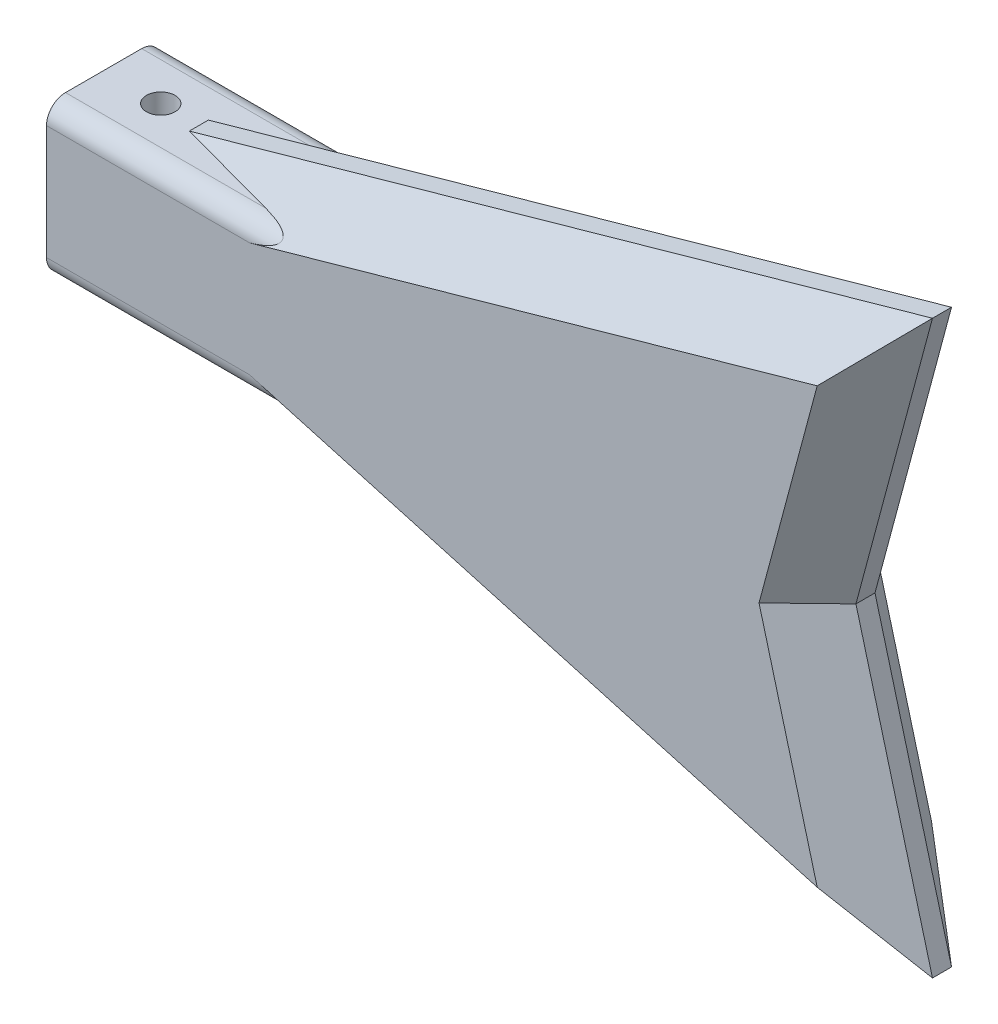
ISO-10303-21;
HEADER;
FILE_DESCRIPTION(('STEP AP214'),'2;1');
FILE_NAME('part.step','',(''),(''),'','','');
FILE_SCHEMA(('AUTOMOTIVE_DESIGN { 1 0 10303 214 1 1 1 1 }'));
ENDSEC;
DATA;
#1=APPLICATION_CONTEXT('core data for automotive mechanical design processes');
#2=APPLICATION_PROTOCOL_DEFINITION('international standard','automotive_design',2000,#1);
#3=PRODUCT_CONTEXT('',#1,'mechanical');
#4=PRODUCT('Part','Part','',(#3));
#5=PRODUCT_RELATED_PRODUCT_CATEGORY('part','',(#4));
#6=PRODUCT_DEFINITION_FORMATION('','',#4);
#7=PRODUCT_DEFINITION_CONTEXT('part definition',#1,'design');
#8=PRODUCT_DEFINITION('design','',#6,#7);
#9=PRODUCT_DEFINITION_SHAPE('','',#8);
#10=(LENGTH_UNIT() NAMED_UNIT(*) SI_UNIT(.MILLI.,.METRE.));
#11=(NAMED_UNIT(*) PLANE_ANGLE_UNIT() SI_UNIT($,.RADIAN.));
#12=(NAMED_UNIT(*) SI_UNIT($,.STERADIAN.) SOLID_ANGLE_UNIT());
#13=UNCERTAINTY_MEASURE_WITH_UNIT(LENGTH_MEASURE(1.E-05),#10,'distance_accuracy_value','');
#14=(GEOMETRIC_REPRESENTATION_CONTEXT(3) GLOBAL_UNCERTAINTY_ASSIGNED_CONTEXT((#13)) GLOBAL_UNIT_ASSIGNED_CONTEXT((#10,
#11,#12)) REPRESENTATION_CONTEXT('',''));
#15=CARTESIAN_POINT('',(0.,0.,0.));
#16=DIRECTION('',(0.,0.,1.));
#17=DIRECTION('',(1.,0.,0.));
#18=AXIS2_PLACEMENT_3D('',#15,#16,#17);
#19=CARTESIAN_POINT('',(10.,8.,6.));
#20=DIRECTION('',(0.,-1.,0.));
#21=DIRECTION('',(1.,0.,0.));
#22=AXIS2_PLACEMENT_3D('',#19,#20,#21);
#23=PLANE('',#22);
#24=CARTESIAN_POINT('',(6.,8.,0.));
#25=DIRECTION('',(0.,1.,0.));
#26=DIRECTION('',(-1.,0.,0.));
#27=AXIS2_PLACEMENT_3D('',#24,#25,#26);
#28=CIRCLE('',#27,1.5);
#29=CARTESIAN_POINT('',(4.5,8.,0.));
#30=VERTEX_POINT('',#29);
#31=EDGE_CURVE('E182',#30,#30,#28,.T.);
#32=ORIENTED_EDGE('',*,*,#31,.F.);
#33=EDGE_LOOP('',(#32));
#34=FACE_BOUND('',#33,.T.);
#35=DIRECTION('',(0.965103812505989,0.,-0.261867583114835));
#36=VECTOR('',#35,1.);
#37=CARTESIAN_POINT('',(8.23089418014901,8.,-0.519977582395162));
#38=LINE('',#37,#36);
#39=CARTESIAN_POINT('',(10.,8.,-0.999999999999996));
#40=VERTEX_POINT('',#39);
#41=CARTESIAN_POINT('',(21.0563950034561,8.,-4.));
#42=VERTEX_POINT('',#41);
#43=EDGE_CURVE('E209',#40,#42,#38,.T.);
#44=ORIENTED_EDGE('',*,*,#43,.T.);
#45=DIRECTION('',(-1.,0.,0.));
#46=VECTOR('',#45,1.);
#47=CARTESIAN_POINT('',(0.,8.,-4.));
#48=LINE('',#47,#46);
#49=CARTESIAN_POINT('',(0.,8.,-4.));
#50=VERTEX_POINT('',#49);
#51=EDGE_CURVE('E241',#42,#50,#48,.T.);
#52=ORIENTED_EDGE('',*,*,#51,.T.);
#53=DIRECTION('',(0.,0.,-1.));
#54=VECTOR('',#53,1.);
#55=CARTESIAN_POINT('',(0.,8.,6.));
#56=LINE('',#55,#54);
#57=CARTESIAN_POINT('',(0.,8.,4.));
#58=VERTEX_POINT('',#57);
#59=EDGE_CURVE('E177',#58,#50,#56,.T.);
#60=ORIENTED_EDGE('',*,*,#59,.F.);
#61=DIRECTION('',(-1.,0.,0.));
#62=VECTOR('',#61,1.);
#63=CARTESIAN_POINT('',(10.,8.,4.));
#64=LINE('',#63,#62);
#65=CARTESIAN_POINT('',(21.056395003456,8.,4.));
#66=VERTEX_POINT('',#65);
#67=EDGE_CURVE('E62',#58,#66,#64,.F.);
#68=ORIENTED_EDGE('',*,*,#67,.T.);
#69=DIRECTION('',(0.965103812505989,0.,0.261867583114835));
#70=VECTOR('',#69,1.);
#71=CARTESIAN_POINT('',(11.2636470141793,8.,1.34287315543202));
#72=LINE('',#71,#70);
#73=CARTESIAN_POINT('',(10.,8.,0.999999999999995));
#74=VERTEX_POINT('',#73);
#75=EDGE_CURVE('E257',#66,#74,#72,.F.);
#76=ORIENTED_EDGE('',*,*,#75,.T.);
#77=DIRECTION('',(0.,0.,-1.));
#78=VECTOR('',#77,1.);
#79=CARTESIAN_POINT('',(10.,8.,6.));
#80=LINE('',#79,#78);
#81=EDGE_CURVE('E328',#74,#40,#80,.T.);
#82=ORIENTED_EDGE('',*,*,#81,.T.);
#83=EDGE_LOOP('',(#44,#52,#60,#68,#76,#82));
#84=FACE_BOUND('',#83,.T.);
#85=ADVANCED_FACE('F39',(#34,#84),#23,.F.);
#86=CARTESIAN_POINT('',(0.,-8.,6.));
#87=DIRECTION('',(1.,0.,0.));
#88=DIRECTION('',(0.,0.,-1.));
#89=AXIS2_PLACEMENT_3D('',#86,#87,#88);
#90=PLANE('',#89);
#91=CARTESIAN_POINT('',(0.,0.,0.));
#92=DIRECTION('',(-1.,0.,0.));
#93=DIRECTION('',(0.,0.,1.));
#94=AXIS2_PLACEMENT_3D('',#91,#92,#93);
#95=CIRCLE('',#94,5.);
#96=CARTESIAN_POINT('',(0.,0.,5.));
#97=VERTEX_POINT('',#96);
#98=EDGE_CURVE('E343',#97,#97,#95,.T.);
#99=ORIENTED_EDGE('',*,*,#98,.F.);
#100=EDGE_LOOP('',(#99));
#101=FACE_BOUND('',#100,.T.);
#102=DIRECTION('',(0.,0.,-1.));
#103=VECTOR('',#102,1.);
#104=CARTESIAN_POINT('',(0.,-8.,6.));
#105=LINE('',#104,#103);
#106=CARTESIAN_POINT('',(0.,-8.,4.));
#107=VERTEX_POINT('',#106);
#108=CARTESIAN_POINT('',(0.,-8.,-4.));
#109=VERTEX_POINT('',#108);
#110=EDGE_CURVE('E308',#107,#109,#105,.T.);
#111=ORIENTED_EDGE('',*,*,#110,.F.);
#112=CARTESIAN_POINT('',(0.,-6.,4.));
#113=DIRECTION('',(1.,0.,0.));
#114=DIRECTION('',(0.,0.,-1.));
#115=AXIS2_PLACEMENT_3D('',#112,#113,#114);
#116=CIRCLE('',#115,2.);
#117=CARTESIAN_POINT('',(0.,-6.,6.));
#118=VERTEX_POINT('',#117);
#119=EDGE_CURVE('E229',#107,#118,#116,.F.);
#120=ORIENTED_EDGE('',*,*,#119,.T.);
#121=DIRECTION('',(0.,-1.,0.));
#122=VECTOR('',#121,1.);
#123=CARTESIAN_POINT('',(0.,-8.,6.));
#124=LINE('',#123,#122);
#125=CARTESIAN_POINT('',(0.,6.,6.));
#126=VERTEX_POINT('',#125);
#127=EDGE_CURVE('E332',#126,#118,#124,.T.);
#128=ORIENTED_EDGE('',*,*,#127,.F.);
#129=CARTESIAN_POINT('',(0.,6.,4.));
#130=DIRECTION('',(1.,0.,0.));
#131=DIRECTION('',(0.,0.,-1.));
#132=AXIS2_PLACEMENT_3D('',#129,#130,#131);
#133=CIRCLE('',#132,2.);
#134=EDGE_CURVE('E220',#126,#58,#133,.F.);
#135=ORIENTED_EDGE('',*,*,#134,.T.);
#136=ORIENTED_EDGE('',*,*,#59,.T.);
#137=CARTESIAN_POINT('',(0.,6.,-4.));
#138=DIRECTION('',(1.,0.,0.));
#139=DIRECTION('',(0.,0.,-1.));
#140=AXIS2_PLACEMENT_3D('',#137,#138,#139);
#141=CIRCLE('',#140,2.);
#142=CARTESIAN_POINT('',(0.,6.,-6.));
#143=VERTEX_POINT('',#142);
#144=EDGE_CURVE('E223',#50,#143,#141,.F.);
#145=ORIENTED_EDGE('',*,*,#144,.T.);
#146=DIRECTION('',(0.,-1.,0.));
#147=VECTOR('',#146,1.);
#148=CARTESIAN_POINT('',(0.,-8.,-6.));
#149=LINE('',#148,#147);
#150=CARTESIAN_POINT('',(0.,-6.,-6.));
#151=VERTEX_POINT('',#150);
#152=EDGE_CURVE('E335',#143,#151,#149,.T.);
#153=ORIENTED_EDGE('',*,*,#152,.T.);
#154=CARTESIAN_POINT('',(0.,-6.,-4.));
#155=DIRECTION('',(1.,0.,0.));
#156=DIRECTION('',(0.,0.,-1.));
#157=AXIS2_PLACEMENT_3D('',#154,#155,#156);
#158=CIRCLE('',#157,2.);
#159=EDGE_CURVE('E226',#151,#109,#158,.F.);
#160=ORIENTED_EDGE('',*,*,#159,.T.);
#161=EDGE_LOOP('',(#111,#120,#128,#135,#136,#145,#153,#160));
#162=FACE_BOUND('',#161,.T.);
#163=ADVANCED_FACE('F389',(#101,#162),#90,.F.);
#164=CARTESIAN_POINT('',(10.,-8.,6.));
#165=DIRECTION('',(0.,1.,0.));
#166=DIRECTION('',(-1.,0.,0.));
#167=AXIS2_PLACEMENT_3D('',#164,#165,#166);
#168=PLANE('',#167);
#169=CARTESIAN_POINT('',(6.,-8.,0.));
#170=DIRECTION('',(0.,1.,0.));
#171=DIRECTION('',(-1.,0.,0.));
#172=AXIS2_PLACEMENT_3D('',#169,#170,#171);
#173=CIRCLE('',#172,1.5);
#174=CARTESIAN_POINT('',(4.5,-8.,0.));
#175=VERTEX_POINT('',#174);
#176=EDGE_CURVE('E347',#175,#175,#173,.T.);
#177=ORIENTED_EDGE('',*,*,#176,.T.);
#178=EDGE_LOOP('',(#177));
#179=FACE_BOUND('',#178,.T.);
#180=DIRECTION('',(-0.965103812505989,0.,-0.261867583114835));
#181=VECTOR('',#180,1.);
#182=CARTESIAN_POINT('',(11.2636470141793,-8.,1.34287315543202));
#183=LINE('',#182,#181);
#184=CARTESIAN_POINT('',(10.,-8.,0.999999999999996));
#185=VERTEX_POINT('',#184);
#186=CARTESIAN_POINT('',(21.056395003456,-8.,4.));
#187=VERTEX_POINT('',#186);
#188=EDGE_CURVE('E260',#185,#187,#183,.F.);
#189=ORIENTED_EDGE('',*,*,#188,.T.);
#190=DIRECTION('',(1.,0.,0.));
#191=VECTOR('',#190,1.);
#192=CARTESIAN_POINT('',(10.,-8.,4.));
#193=LINE('',#192,#191);
#194=EDGE_CURVE('E217',#187,#107,#193,.F.);
#195=ORIENTED_EDGE('',*,*,#194,.T.);
#196=ORIENTED_EDGE('',*,*,#110,.T.);
#197=DIRECTION('',(1.,0.,0.));
#198=VECTOR('',#197,1.);
#199=CARTESIAN_POINT('',(28.4273250057601,-7.99999999999999,-4.));
#200=LINE('',#199,#198);
#201=CARTESIAN_POINT('',(21.0563950034561,-8.,-4.));
#202=VERTEX_POINT('',#201);
#203=EDGE_CURVE('E213',#109,#202,#200,.T.);
#204=ORIENTED_EDGE('',*,*,#203,.T.);
#205=DIRECTION('',(-0.965103812505989,0.,0.261867583114834));
#206=VECTOR('',#205,1.);
#207=CARTESIAN_POINT('',(8.23089418014901,-8.,-0.519977582395164));
#208=LINE('',#207,#206);
#209=CARTESIAN_POINT('',(10.,-8.,-0.999999999999995));
#210=VERTEX_POINT('',#209);
#211=EDGE_CURVE('E254',#202,#210,#208,.T.);
#212=ORIENTED_EDGE('',*,*,#211,.T.);
#213=DIRECTION('',(0.,0.,-1.));
#214=VECTOR('',#213,1.);
#215=CARTESIAN_POINT('',(10.,-8.,6.));
#216=LINE('',#215,#214);
#217=EDGE_CURVE('E312',#185,#210,#216,.T.);
#218=ORIENTED_EDGE('',*,*,#217,.F.);
#219=EDGE_LOOP('',(#189,#195,#196,#204,#212,#218));
#220=FACE_BOUND('',#219,.T.);
#221=ADVANCED_FACE('F395',(#179,#220),#168,.F.);
#222=CARTESIAN_POINT('',(10.,-8.,6.));
#223=DIRECTION('',(0.27133618137397,0.962484637112402,0.));
#224=DIRECTION('',(-0.962484637112402,0.27133618137397,0.));
#225=AXIS2_PLACEMENT_3D('',#222,#223,#224);
#226=PLANE('',#225);
#227=DIRECTION('',(0.,0.,-1.));
#228=VECTOR('',#227,1.);
#229=CARTESIAN_POINT('',(88.0384757729336,-30.,6.));
#230=LINE('',#229,#228);
#231=CARTESIAN_POINT('',(88.0384757729336,-30.,0.999999999999997));
#232=VERTEX_POINT('',#231);
#233=CARTESIAN_POINT('',(88.0384757729336,-30.,-0.999999999999996));
#234=VERTEX_POINT('',#233);
#235=EDGE_CURVE('E316',#232,#234,#230,.T.);
#236=ORIENTED_EDGE('',*,*,#235,.F.);
#237=DIRECTION('',(-0.962484637112402,0.27133618137397,0.));
#238=VECTOR('',#237,1.);
#239=CARTESIAN_POINT('',(10.,-8.,0.999999999999996));
#240=LINE('',#239,#238);
#241=EDGE_CURVE('E293',#232,#185,#240,.T.);
#242=ORIENTED_EDGE('',*,*,#241,.T.);
#243=ORIENTED_EDGE('',*,*,#217,.T.);
#244=DIRECTION('',(0.962484637112402,-0.27133618137397,0.));
#245=VECTOR('',#244,1.);
#246=CARTESIAN_POINT('',(88.0384757729336,-30.,-0.999999999999995));
#247=LINE('',#246,#245);
#248=EDGE_CURVE('E296',#210,#234,#247,.T.);
#249=ORIENTED_EDGE('',*,*,#248,.T.);
#250=EDGE_LOOP('',(#236,#242,#243,#249));
#251=FACE_BOUND('',#250,.T.);
#252=ADVANCED_FACE('F460',(#251),#226,.F.);
#253=CARTESIAN_POINT('',(88.0384757729336,-30.,6.));
#254=DIRECTION('',(-0.965925826289069,-0.258819045102518,0.));
#255=DIRECTION('',(0.258819045102518,-0.965925826289069,0.));
#256=AXIS2_PLACEMENT_3D('',#253,#254,#255);
#257=PLANE('',#256);
#258=DIRECTION('',(0.,0.,-1.));
#259=VECTOR('',#258,1.);
#260=CARTESIAN_POINT('',(80.,0.,6.));
#261=LINE('',#260,#259);
#262=CARTESIAN_POINT('',(80.,0.,0.999999999999996));
#263=VERTEX_POINT('',#262);
#264=CARTESIAN_POINT('',(80.,0.,-0.999999999999996));
#265=VERTEX_POINT('',#264);
#266=EDGE_CURVE('E320',#263,#265,#261,.T.);
#267=ORIENTED_EDGE('',*,*,#266,.F.);
#268=DIRECTION('',(0.258819045102518,-0.965925826289069,0.));
#269=VECTOR('',#268,1.);
#270=CARTESIAN_POINT('',(88.0384757729336,-30.,0.999999999999997));
#271=LINE('',#270,#269);
#272=EDGE_CURVE('E287',#263,#232,#271,.T.);
#273=ORIENTED_EDGE('',*,*,#272,.T.);
#274=ORIENTED_EDGE('',*,*,#235,.T.);
#275=DIRECTION('',(-0.258819045102518,0.965925826289069,0.));
#276=VECTOR('',#275,1.);
#277=CARTESIAN_POINT('',(80.,0.,-0.999999999999996));
#278=LINE('',#277,#276);
#279=EDGE_CURVE('E290',#234,#265,#278,.T.);
#280=ORIENTED_EDGE('',*,*,#279,.T.);
#281=EDGE_LOOP('',(#267,#273,#274,#280));
#282=FACE_BOUND('',#281,.T.);
#283=ADVANCED_FACE('F468',(#282),#257,.F.);
#284=CARTESIAN_POINT('',(88.0384757729336,30.,6.));
#285=DIRECTION('',(-0.965925826289069,0.258819045102518,0.));
#286=DIRECTION('',(-0.258819045102518,-0.965925826289069,0.));
#287=AXIS2_PLACEMENT_3D('',#284,#285,#286);
#288=PLANE('',#287);
#289=DIRECTION('',(0.,0.,-1.));
#290=VECTOR('',#289,1.);
#291=CARTESIAN_POINT('',(88.0384757729336,30.,6.));
#292=LINE('',#291,#290);
#293=CARTESIAN_POINT('',(88.0384757729336,30.,0.999999999999996));
#294=VERTEX_POINT('',#293);
#295=CARTESIAN_POINT('',(88.0384757729336,30.,-0.999999999999996));
#296=VERTEX_POINT('',#295);
#297=EDGE_CURVE('E324',#294,#296,#292,.T.);
#298=ORIENTED_EDGE('',*,*,#297,.F.);
#299=DIRECTION('',(-0.258819045102518,-0.965925826289069,0.));
#300=VECTOR('',#299,1.);
#301=CARTESIAN_POINT('',(88.0384757729336,30.,0.999999999999996));
#302=LINE('',#301,#300);
#303=EDGE_CURVE('E180',#294,#263,#302,.T.);
#304=ORIENTED_EDGE('',*,*,#303,.T.);
#305=ORIENTED_EDGE('',*,*,#266,.T.);
#306=DIRECTION('',(0.258819045102518,0.965925826289069,0.));
#307=VECTOR('',#306,1.);
#308=CARTESIAN_POINT('',(88.0384757729336,30.,-0.999999999999996));
#309=LINE('',#308,#307);
#310=EDGE_CURVE('E284',#265,#296,#309,.T.);
#311=ORIENTED_EDGE('',*,*,#310,.T.);
#312=EDGE_LOOP('',(#298,#304,#305,#311));
#313=FACE_BOUND('',#312,.T.);
#314=ADVANCED_FACE('F472',(#313),#288,.F.);
#315=CARTESIAN_POINT('',(10.,8.,6.));
#316=DIRECTION('',(0.27133618137397,-0.962484637112402,0.));
#317=DIRECTION('',(0.962484637112402,0.27133618137397,0.));
#318=AXIS2_PLACEMENT_3D('',#315,#316,#317);
#319=PLANE('',#318);
#320=ORIENTED_EDGE('',*,*,#81,.F.);
#321=DIRECTION('',(0.962484637112402,0.27133618137397,0.));
#322=VECTOR('',#321,1.);
#323=CARTESIAN_POINT('',(10.,8.,0.999999999999995));
#324=LINE('',#323,#322);
#325=EDGE_CURVE('E276',#74,#294,#324,.T.);
#326=ORIENTED_EDGE('',*,*,#325,.T.);
#327=ORIENTED_EDGE('',*,*,#297,.T.);
#328=DIRECTION('',(-0.962484637112402,-0.27133618137397,0.));
#329=VECTOR('',#328,1.);
#330=CARTESIAN_POINT('',(10.,8.,-0.999999999999996));
#331=LINE('',#330,#329);
#332=EDGE_CURVE('E279',#296,#40,#331,.T.);
#333=ORIENTED_EDGE('',*,*,#332,.T.);
#334=EDGE_LOOP('',(#320,#326,#327,#333));
#335=FACE_BOUND('',#334,.T.);
#336=ADVANCED_FACE('F478',(#335),#319,.F.);
#337=CARTESIAN_POINT('',(0.,0.,6.));
#338=DIRECTION('',(0.,0.,-1.));
#339=DIRECTION('',(-1.,0.,0.));
#340=AXIS2_PLACEMENT_3D('',#337,#338,#339);
#341=PLANE('',#340);
#342=ORIENTED_EDGE('',*,*,#127,.T.);
#343=DIRECTION('',(1.,0.,0.));
#344=VECTOR('',#343,1.);
#345=CARTESIAN_POINT('',(0.,-6.,6.));
#346=LINE('',#345,#344);
#347=CARTESIAN_POINT('',(21.3329181173116,-6.,6.));
#348=VERTEX_POINT('',#347);
#349=EDGE_CURVE('E208',#118,#348,#346,.T.);
#350=ORIENTED_EDGE('',*,*,#349,.T.);
#351=DIRECTION('',(0.962484637112402,-0.27133618137397,0.));
#352=VECTOR('',#351,1.);
#353=CARTESIAN_POINT('',(0.00365889157440522,0.0129788327947733,6.));
#354=LINE('',#353,#352);
#355=CARTESIAN_POINT('',(80.9334265058361,-22.8021116706935,6.));
#356=VERTEX_POINT('',#355);
#357=EDGE_CURVE('E300',#348,#356,#354,.T.);
#358=ORIENTED_EDGE('',*,*,#357,.T.);
#359=DIRECTION('',(-0.258819045102518,0.965925826289069,0.));
#360=VECTOR('',#359,1.);
#361=CARTESIAN_POINT('',(69.8113870199323,18.7059047744872,6.));
#362=LINE('',#361,#360);
#363=CARTESIAN_POINT('',(74.8236190979496,0.,6.));
#364=VERTEX_POINT('',#363);
#365=EDGE_CURVE('E161',#356,#364,#362,.T.);
#366=ORIENTED_EDGE('',*,*,#365,.T.);
#367=DIRECTION('',(0.258819045102518,0.965925826289069,0.));
#368=VECTOR('',#367,1.);
#369=CARTESIAN_POINT('',(69.8113870199323,-18.7059047744872,6.));
#370=LINE('',#369,#368);
#371=CARTESIAN_POINT('',(80.9334265058361,22.8021116706935,6.));
#372=VERTEX_POINT('',#371);
#373=EDGE_CURVE('E153',#364,#372,#370,.T.);
#374=ORIENTED_EDGE('',*,*,#373,.T.);
#375=DIRECTION('',(-0.962484637112402,-0.27133618137397,0.));
#376=VECTOR('',#375,1.);
#377=CARTESIAN_POINT('',(0.00365889157440393,-0.0129788327947687,6.));
#378=LINE('',#377,#376);
#379=CARTESIAN_POINT('',(21.3329181173115,6.,6.));
#380=VERTEX_POINT('',#379);
#381=EDGE_CURVE('E158',#372,#380,#378,.T.);
#382=ORIENTED_EDGE('',*,*,#381,.T.);
#383=DIRECTION('',(-1.,0.,0.));
#384=VECTOR('',#383,1.);
#385=CARTESIAN_POINT('',(0.,6.,6.));
#386=LINE('',#385,#384);
#387=EDGE_CURVE('E205',#380,#126,#386,.T.);
#388=ORIENTED_EDGE('',*,*,#387,.T.);
#389=EDGE_LOOP('',(#342,#350,#358,#366,#374,#382,#388));
#390=FACE_BOUND('',#389,.T.);
#391=ADVANCED_FACE('F156',(#390),#341,.F.);
#392=CARTESIAN_POINT('',(0.,0.,-6.));
#393=DIRECTION('',(0.,0.,-1.));
#394=DIRECTION('',(-1.,0.,0.));
#395=AXIS2_PLACEMENT_3D('',#392,#393,#394);
#396=PLANE('',#395);
#397=DIRECTION('',(-0.962484637112402,0.27133618137397,0.));
#398=VECTOR('',#397,1.);
#399=CARTESIAN_POINT('',(11.3566809068699,-3.18757681443798,-6.));
#400=LINE('',#399,#398);
#401=CARTESIAN_POINT('',(80.9334265058361,-22.8021116706935,-6.));
#402=VERTEX_POINT('',#401);
#403=CARTESIAN_POINT('',(21.3329181173116,-6.,-6.));
#404=VERTEX_POINT('',#403);
#405=EDGE_CURVE('E264',#402,#404,#400,.T.);
#406=ORIENTED_EDGE('',*,*,#405,.T.);
#407=DIRECTION('',(1.,0.,0.));
#408=VECTOR('',#407,1.);
#409=CARTESIAN_POINT('',(0.,-6.,-6.));
#410=LINE('',#409,#408);
#411=EDGE_CURVE('E236',#404,#151,#410,.F.);
#412=ORIENTED_EDGE('',*,*,#411,.T.);
#413=ORIENTED_EDGE('',*,*,#152,.F.);
#414=DIRECTION('',(-1.,0.,0.));
#415=VECTOR('',#414,1.);
#416=CARTESIAN_POINT('',(28.4273250057601,5.99999999999999,-6.));
#417=LINE('',#416,#415);
#418=CARTESIAN_POINT('',(21.3329181173116,5.99999999999999,-6.));
#419=VERTEX_POINT('',#418);
#420=EDGE_CURVE('E232',#143,#419,#417,.F.);
#421=ORIENTED_EDGE('',*,*,#420,.T.);
#422=DIRECTION('',(0.962484637112402,0.27133618137397,0.));
#423=VECTOR('',#422,1.);
#424=CARTESIAN_POINT('',(89.3951566798034,25.187576814438,-6.));
#425=LINE('',#424,#423);
#426=CARTESIAN_POINT('',(80.9334265058361,22.8021116706935,-6.));
#427=VERTEX_POINT('',#426);
#428=EDGE_CURVE('E273',#419,#427,#425,.T.);
#429=ORIENTED_EDGE('',*,*,#428,.T.);
#430=DIRECTION('',(-0.258819045102518,-0.965925826289069,0.));
#431=VECTOR('',#430,1.);
#432=CARTESIAN_POINT('',(75.1703708685546,1.29409522551259,-6.));
#433=LINE('',#432,#431);
#434=CARTESIAN_POINT('',(74.8236190979496,0.,-6.));
#435=VERTEX_POINT('',#434);
#436=EDGE_CURVE('E270',#427,#435,#433,.T.);
#437=ORIENTED_EDGE('',*,*,#436,.T.);
#438=DIRECTION('',(0.258819045102518,-0.965925826289069,0.));
#439=VECTOR('',#438,1.);
#440=CARTESIAN_POINT('',(83.2088466414882,-31.2940952255126,-6.));
#441=LINE('',#440,#439);
#442=EDGE_CURVE('E267',#435,#402,#441,.T.);
#443=ORIENTED_EDGE('',*,*,#442,.T.);
#444=EDGE_LOOP('',(#406,#412,#413,#421,#429,#437,#443));
#445=FACE_BOUND('',#444,.T.);
#446=ADVANCED_FACE('F386',(#445),#396,.T.);
#447=CARTESIAN_POINT('',(14.,0.,0.));
#448=DIRECTION('',(-1.,0.,0.));
#449=DIRECTION('',(0.,0.,1.));
#450=AXIS2_PLACEMENT_3D('',#447,#448,#449);
#451=CYLINDRICAL_SURFACE('',#450,5.);
#452=CARTESIAN_POINT('',(4.5,-5.,0.));
#453=CARTESIAN_POINT('',(4.50000099748488,-4.9999992925055,-0.0822886127533));
#454=CARTESIAN_POINT('',(4.50679386362396,-4.99794915693954,-0.164587318351529));
#455=CARTESIAN_POINT('',(4.5337213542221,-4.98997105593691,-0.326788125304881));
#456=CARTESIAN_POINT('',(4.55385995802334,-4.98404193389692,-0.40668950441142));
#457=CARTESIAN_POINT('',(4.60674601691026,-4.96895552501836,-0.561732707754526));
#458=CARTESIAN_POINT('',(4.63947486961893,-4.95980300250425,-0.636881364395373));
#459=CARTESIAN_POINT('',(4.71653609305583,-4.93922109237645,-0.780624181053131));
#460=CARTESIAN_POINT('',(4.76087000739541,-4.92779140192067,-0.849217467469669));
#461=CARTESIAN_POINT('',(4.86122400747267,-4.90350737192774,-0.979871797183745));
#462=CARTESIAN_POINT('',(4.91751662588591,-4.89062383657036,-1.04171807124434));
#463=CARTESIAN_POINT('',(5.03960922991018,-4.86505834210442,-1.15524920923324));
#464=CARTESIAN_POINT('',(5.10541081212496,-4.85237641724501,-1.20693236327441));
#465=CARTESIAN_POINT('',(5.24647075303761,-4.82834113993772,-1.29980037723708));
#466=CARTESIAN_POINT('',(5.32190846099073,-4.81702406663875,-1.34072309022213));
#467=CARTESIAN_POINT('',(5.47898925423029,-4.79743620394031,-1.4092139477476));
#468=CARTESIAN_POINT('',(5.56063084392797,-4.78916468313311,-1.43678529919973));
#469=CARTESIAN_POINT('',(5.72539026613046,-4.77690870838434,-1.47701633682652));
#470=CARTESIAN_POINT('',(5.80840274386394,-4.77281069324533,-1.49007196234677));
#471=CARTESIAN_POINT('',(5.97553315621676,-4.76902789749767,-1.50213730614672));
#472=CARTESIAN_POINT('',(6.05965081805908,-4.76934204760571,-1.50115042761078));
#473=CARTESIAN_POINT('',(6.22338390860848,-4.77424744067778,-1.48546977199812));
#474=CARTESIAN_POINT('',(6.30305225036224,-4.7786838859914,-1.47127205262685));
#475=CARTESIAN_POINT('',(6.45881978627346,-4.79108356228624,-1.43037420427056));
#476=CARTESIAN_POINT('',(6.53491862737433,-4.79904714132351,-1.40367284141641));
#477=CARTESIAN_POINT('',(6.68260034966074,-4.81772733074973,-1.33816026653682));
#478=CARTESIAN_POINT('',(6.75410708395526,-4.82848016115952,-1.29918816934643));
#479=CARTESIAN_POINT('',(6.88973202201019,-4.85150987000065,-1.21035222588683));
#480=CARTESIAN_POINT('',(6.95384842941378,-4.86378711746991,-1.16048574002588));
#481=CARTESIAN_POINT('',(7.07568619076202,-4.88911011297937,-1.04881290765546));
#482=CARTESIAN_POINT('',(7.13302866402967,-4.90216654310498,-0.986594907466972));
#483=CARTESIAN_POINT('',(7.23655398406425,-4.92712244063259,-0.853263259313967));
#484=CARTESIAN_POINT('',(7.28273612841442,-4.9390218351841,-0.782149051860888));
#485=CARTESIAN_POINT('',(7.36285992246473,-4.9604316006947,-0.632355038342803));
#486=CARTESIAN_POINT('',(7.39671751624986,-4.96992543668314,-0.55362774974795));
#487=CARTESIAN_POINT('',(7.45059959009963,-4.98533521832222,-0.391245415603519));
#488=CARTESIAN_POINT('',(7.47062792853249,-4.99125216186999,-0.307591751589582));
#489=CARTESIAN_POINT('',(7.49565217789939,-4.99868364643538,-0.140952242668332));
#490=CARTESIAN_POINT('',(7.50116158580161,-5.0003485041779,-0.0580500976011872));
#491=CARTESIAN_POINT('',(7.49843084428792,-4.9995292324176,0.107499605823383));
#492=CARTESIAN_POINT('',(7.49019253034856,-4.99704565677756,0.19014719669078));
#493=CARTESIAN_POINT('',(7.4606153888885,-4.98830696987163,0.350903605309697));
#494=CARTESIAN_POINT('',(7.43957661241913,-4.98213829799417,0.429072772614169));
#495=CARTESIAN_POINT('',(7.3853567672218,-4.96674347841533,0.580754638954522));
#496=CARTESIAN_POINT('',(7.35217423896214,-4.95751696321085,0.654266777025583));
#497=CARTESIAN_POINT('',(7.27374683451887,-4.93669654351325,0.796437189461052));
#498=CARTESIAN_POINT('',(7.22824065905203,-4.92505280829675,0.86494382619967));
#499=CARTESIAN_POINT('',(7.12677524594719,-4.90073468764318,0.993523307980147));
#500=CARTESIAN_POINT('',(7.07081338811233,-4.8880600443108,1.05359403235593));
#501=CARTESIAN_POINT('',(6.94761269163065,-4.86253171869138,1.16585744551027));
#502=CARTESIAN_POINT('',(6.88003812422826,-4.84968825033268,1.21768481231504));
#503=CARTESIAN_POINT('',(6.73687206098647,-4.82576515238463,1.30928995072154));
#504=CARTESIAN_POINT('',(6.66128077544178,-4.81468547654651,1.34906803829472));
#505=CARTESIAN_POINT('',(6.50446750874531,-4.79567189615055,1.41517347127168));
#506=CARTESIAN_POINT('',(6.42327381346341,-4.78772337843827,1.4415634693705));
#507=CARTESIAN_POINT('',(6.25731203106852,-4.77591594362794,1.48021730815114));
#508=CARTESIAN_POINT('',(6.17254517921233,-4.772055625083,1.49248598978779));
#509=CARTESIAN_POINT('',(6.00563848162377,-4.76899972496087,1.50221984485059));
#510=CARTESIAN_POINT('',(5.92353634898241,-4.76961647442754,1.5002805530849));
#511=CARTESIAN_POINT('',(5.7608858966272,-4.77499401288294,1.48307505444813));
#512=CARTESIAN_POINT('',(5.68033751482364,-4.77975463592551,1.46780938124716));
#513=CARTESIAN_POINT('',(5.52405460085715,-4.79275763670386,1.42476888804136));
#514=CARTESIAN_POINT('',(5.4482727126383,-4.80095604545965,1.39715175507069));
#515=CARTESIAN_POINT('',(5.30235756118227,-4.81990278909136,1.33031507121129));
#516=CARTESIAN_POINT('',(5.23222538235924,-4.83065161194312,1.29109329962876));
#517=CARTESIAN_POINT('',(5.09683688347289,-4.85397676425833,1.20048763805072));
#518=CARTESIAN_POINT('',(5.03185123873959,-4.86660540163798,1.14871276092994));
#519=CARTESIAN_POINT('',(4.91129750169214,-4.89201320450026,1.03517434629782));
#520=CARTESIAN_POINT('',(4.85573186053224,-4.90479240823905,0.973408217134502));
#521=CARTESIAN_POINT('',(4.75397658770497,-4.92950936570649,0.839465762183249));
#522=CARTESIAN_POINT('',(4.70810855314451,-4.94141159765674,0.767037885790608));
#523=CARTESIAN_POINT('',(4.62926483009597,-4.96260680455813,0.61514137398353));
#524=CARTESIAN_POINT('',(4.59628311172549,-4.97190099931067,0.535676052998956));
#525=CARTESIAN_POINT('',(4.54710472434725,-4.98602174969301,0.380757712655282));
#526=CARTESIAN_POINT('',(4.52948832711675,-4.99122027381068,0.305786961954234));
#527=CARTESIAN_POINT('',(4.50593647475842,-4.99820944494492,0.15388019523078));
#528=CARTESIAN_POINT('',(4.49999906729518,-5.0000006615474,0.0769445098581396));
#529=CARTESIAN_POINT('',(4.5,-5.,0.));
#530=B_SPLINE_CURVE_WITH_KNOTS('',3,(#452,#453,#454,#455,#456,#457,#458,#459,#460,#461,#462,
#463,#464,#465,#466,#467,#468,#469,#470,#471,#472,#473,#474,#475,#476,#477,#478,#479,#480,#481,
#482,#483,#484,#485,#486,#487,#488,#489,#490,#491,#492,#493,#494,#495,#496,#497,#498,#499,#500,
#501,#502,#503,#504,#505,#506,#507,#508,#509,#510,#511,#512,#513,#514,#515,#516,#517,#518,#519,
#520,#521,#522,#523,#524,#525,#526,#527,#528,#529),.UNSPECIFIED.,.T.,.F.,(4,2,2,2,2,2,2,2,2,2,2,
2,2,2,2,2,2,2,2,2,2,2,2,2,2,2,2,2,2,2,2,2,2,2,2,2,2,2,4),(0.,0.246583203612611,
0.493239964845999,0.739533676300874,0.985860164412701,1.23855602948191,1.49129437288633,
1.74971481004109,2.00807314543224,2.25919689356599,2.51025978319089,2.75226016697676,
2.99428443658001,3.2396242644712,3.48502360158556,3.74067104048167,3.99633456531072,
4.25371046881689,4.51101453528808,4.75908809438545,5.00712853550327,5.24956746682327,
5.49203554593729,5.74011305702908,5.98825282000191,6.24540400322819,6.50254844252681,
6.75847814951252,7.01432009460283,7.25950155466943,7.504673196616,7.74680040402721,
7.98897397553107,8.23996925679931,8.49102974897503,8.74942996156671,9.00770911595235,
9.2383169193046,9.46888616948875),.UNSPECIFIED.);
#531=CARTESIAN_POINT('',(4.5,-5.,0.));
#532=VERTEX_POINT('',#531);
#533=EDGE_CURVE('E351',#532,#532,#530,.T.);
#534=ORIENTED_EDGE('',*,*,#533,.T.);
#535=EDGE_LOOP('',(#534));
#536=FACE_BOUND('',#535,.T.);
#537=CARTESIAN_POINT('',(4.5,5.,0.));
#538=CARTESIAN_POINT('',(4.50000099748488,4.9999992925055,0.0822886127532999));
#539=CARTESIAN_POINT('',(4.50679386362397,4.99794915693954,0.164587318351529));
#540=CARTESIAN_POINT('',(4.5337213542221,4.98997105593691,0.326788125304881));
#541=CARTESIAN_POINT('',(4.55385995802334,4.98404193389692,0.40668950441142));
#542=CARTESIAN_POINT('',(4.60674601691026,4.96895552501836,0.561732707754526));
#543=CARTESIAN_POINT('',(4.63947486961894,4.95980300250425,0.636881364395373));
#544=CARTESIAN_POINT('',(4.71653609305583,4.93922109237645,0.780624181053131));
#545=CARTESIAN_POINT('',(4.76087000739542,4.92779140192067,0.849217467469669));
#546=CARTESIAN_POINT('',(4.86122400747267,4.90350737192774,0.979871797183745));
#547=CARTESIAN_POINT('',(4.91751662588591,4.89062383657036,1.04171807124434));
#548=CARTESIAN_POINT('',(5.03960922991018,4.86505834210442,1.15524920923324));
#549=CARTESIAN_POINT('',(5.10541081212496,4.85237641724501,1.20693236327441));
#550=CARTESIAN_POINT('',(5.24647075303761,4.82834113993772,1.29980037723708));
#551=CARTESIAN_POINT('',(5.32190846099074,4.81702406663875,1.34072309022213));
#552=CARTESIAN_POINT('',(5.47898925423029,4.79743620394031,1.4092139477476));
#553=CARTESIAN_POINT('',(5.56063084392797,4.78916468313311,1.43678529919973));
#554=CARTESIAN_POINT('',(5.72539026613046,4.77690870838434,1.47701633682652));
#555=CARTESIAN_POINT('',(5.80840274386394,4.77281069324533,1.49007196234677));
#556=CARTESIAN_POINT('',(5.97553315621677,4.76902789749767,1.50213730614672));
#557=CARTESIAN_POINT('',(6.05965081805909,4.76934204760571,1.50115042761078));
#558=CARTESIAN_POINT('',(6.22338390860848,4.77424744067778,1.48546977199812));
#559=CARTESIAN_POINT('',(6.30305225036224,4.7786838859914,1.47127205262685));
#560=CARTESIAN_POINT('',(6.45881978627346,4.79108356228624,1.43037420427056));
#561=CARTESIAN_POINT('',(6.53491862737433,4.79904714132351,1.40367284141641));
#562=CARTESIAN_POINT('',(6.68260034966074,4.81772733074973,1.33816026653682));
#563=CARTESIAN_POINT('',(6.75410708395526,4.82848016115952,1.29918816934643));
#564=CARTESIAN_POINT('',(6.88973202201019,4.85150987000065,1.21035222588683));
#565=CARTESIAN_POINT('',(6.95384842941378,4.86378711746991,1.16048574002588));
#566=CARTESIAN_POINT('',(7.07568619076202,4.88911011297937,1.04881290765546));
#567=CARTESIAN_POINT('',(7.13302866402967,4.90216654310498,0.986594907466973));
#568=CARTESIAN_POINT('',(7.23655398406425,4.92712244063259,0.853263259313968));
#569=CARTESIAN_POINT('',(7.28273612841443,4.9390218351841,0.782149051860888));
#570=CARTESIAN_POINT('',(7.36285992246473,4.9604316006947,0.632355038342803));
#571=CARTESIAN_POINT('',(7.39671751624986,4.96992543668314,0.55362774974795));
#572=CARTESIAN_POINT('',(7.45059959009963,4.98533521832222,0.391245415603519));
#573=CARTESIAN_POINT('',(7.47062792853249,4.99125216186999,0.307591751589582));
#574=CARTESIAN_POINT('',(7.49565217789939,4.99868364643538,0.140952242668332));
#575=CARTESIAN_POINT('',(7.50116158580161,5.0003485041779,0.0580500976011873));
#576=CARTESIAN_POINT('',(7.49843084428792,4.9995292324176,-0.107499605823383));
#577=CARTESIAN_POINT('',(7.49019253034856,4.99704565677756,-0.19014719669078));
#578=CARTESIAN_POINT('',(7.4606153888885,4.98830696987163,-0.350903605309697));
#579=CARTESIAN_POINT('',(7.43957661241913,4.98213829799417,-0.429072772614169));
#580=CARTESIAN_POINT('',(7.3853567672218,4.96674347841533,-0.580754638954522));
#581=CARTESIAN_POINT('',(7.35217423896214,4.95751696321085,-0.654266777025583));
#582=CARTESIAN_POINT('',(7.27374683451887,4.93669654351325,-0.796437189461052));
#583=CARTESIAN_POINT('',(7.22824065905203,4.92505280829675,-0.86494382619967));
#584=CARTESIAN_POINT('',(7.12677524594719,4.90073468764318,-0.993523307980147));
#585=CARTESIAN_POINT('',(7.07081338811233,4.8880600443108,-1.05359403235593));
#586=CARTESIAN_POINT('',(6.94761269163065,4.86253171869138,-1.16585744551027));
#587=CARTESIAN_POINT('',(6.88003812422826,4.84968825033268,-1.21768481231503));
#588=CARTESIAN_POINT('',(6.73687206098647,4.82576515238463,-1.30928995072154));
#589=CARTESIAN_POINT('',(6.66128077544179,4.81468547654651,-1.34906803829472));
#590=CARTESIAN_POINT('',(6.50446750874531,4.79567189615055,-1.41517347127168));
#591=CARTESIAN_POINT('',(6.42327381346341,4.78772337843827,-1.4415634693705));
#592=CARTESIAN_POINT('',(6.25731203106852,4.77591594362794,-1.48021730815114));
#593=CARTESIAN_POINT('',(6.17254517921233,4.772055625083,-1.49248598978779));
#594=CARTESIAN_POINT('',(6.00563848162377,4.76899972496087,-1.50221984485059));
#595=CARTESIAN_POINT('',(5.92353634898241,4.76961647442754,-1.5002805530849));
#596=CARTESIAN_POINT('',(5.7608858966272,4.77499401288294,-1.48307505444813));
#597=CARTESIAN_POINT('',(5.68033751482365,4.77975463592551,-1.46780938124716));
#598=CARTESIAN_POINT('',(5.52405460085715,4.79275763670386,-1.42476888804136));
#599=CARTESIAN_POINT('',(5.44827271263831,4.80095604545965,-1.39715175507068));
#600=CARTESIAN_POINT('',(5.30235756118228,4.81990278909136,-1.33031507121129));
#601=CARTESIAN_POINT('',(5.23222538235924,4.83065161194312,-1.29109329962876));
#602=CARTESIAN_POINT('',(5.09683688347289,4.85397676425833,-1.20048763805072));
#603=CARTESIAN_POINT('',(5.03185123873959,4.86660540163798,-1.14871276092994));
#604=CARTESIAN_POINT('',(4.91129750169214,4.89201320450026,-1.03517434629782));
#605=CARTESIAN_POINT('',(4.85573186053224,4.90479240823905,-0.973408217134503));
#606=CARTESIAN_POINT('',(4.75397658770497,4.92950936570649,-0.83946576218325));
#607=CARTESIAN_POINT('',(4.70810855314451,4.94141159765674,-0.767037885790609));
#608=CARTESIAN_POINT('',(4.62926483009597,4.96260680455813,-0.615141373983531));
#609=CARTESIAN_POINT('',(4.59628311172549,4.97190099931067,-0.535676052998956));
#610=CARTESIAN_POINT('',(4.54710472434725,4.98602174969301,-0.380757712655282));
#611=CARTESIAN_POINT('',(4.52948832711675,4.99122027381068,-0.305786961954235));
#612=CARTESIAN_POINT('',(4.50593647475842,4.99820944494492,-0.15388019523078));
#613=CARTESIAN_POINT('',(4.49999906729518,5.0000006615474,-0.0769445098581397));
#614=CARTESIAN_POINT('',(4.5,5.,0.));
#615=B_SPLINE_CURVE_WITH_KNOTS('',3,(#537,#538,#539,#540,#541,#542,#543,#544,#545,#546,#547,
#548,#549,#550,#551,#552,#553,#554,#555,#556,#557,#558,#559,#560,#561,#562,#563,#564,#565,#566,
#567,#568,#569,#570,#571,#572,#573,#574,#575,#576,#577,#578,#579,#580,#581,#582,#583,#584,#585,
#586,#587,#588,#589,#590,#591,#592,#593,#594,#595,#596,#597,#598,#599,#600,#601,#602,#603,#604,
#605,#606,#607,#608,#609,#610,#611,#612,#613,#614),.UNSPECIFIED.,.T.,.F.,(4,2,2,2,2,2,2,2,2,2,2,
2,2,2,2,2,2,2,2,2,2,2,2,2,2,2,2,2,2,2,2,2,2,2,2,2,2,2,4),(0.,0.246583203612611,
0.493239964845999,0.739533676300874,0.985860164412701,1.23855602948191,1.49129437288633,
1.74971481004109,2.00807314543224,2.25919689356599,2.51025978319089,2.75226016697676,
2.99428443658001,3.2396242644712,3.48502360158555,3.74067104048167,3.99633456531072,
4.25371046881689,4.51101453528808,4.75908809438545,5.00712853550327,5.24956746682327,
5.49203554593729,5.74011305702909,5.98825282000191,6.24540400322819,6.50254844252681,
6.75847814951252,7.01432009460283,7.25950155466943,7.504673196616,7.74680040402721,
7.98897397553107,8.23996925679931,8.49102974897503,8.74942996156671,9.00770911595235,
9.2383169193046,9.46888616948875),.UNSPECIFIED.);
#616=CARTESIAN_POINT('',(4.5,5.,0.));
#617=VERTEX_POINT('',#616);
#618=EDGE_CURVE('E188',#617,#617,#615,.T.);
#619=ORIENTED_EDGE('',*,*,#618,.T.);
#620=EDGE_LOOP('',(#619));
#621=FACE_BOUND('',#620,.T.);
#622=CARTESIAN_POINT('',(14.,0.,0.));
#623=DIRECTION('',(-1.,0.,0.));
#624=DIRECTION('',(0.,0.,1.));
#625=AXIS2_PLACEMENT_3D('',#622,#623,#624);
#626=CIRCLE('',#625,5.);
#627=CARTESIAN_POINT('',(14.,0.,5.));
#628=VERTEX_POINT('',#627);
#629=EDGE_CURVE('E339',#628,#628,#626,.T.);
#630=ORIENTED_EDGE('',*,*,#629,.F.);
#631=EDGE_LOOP('',(#630));
#632=FACE_BOUND('',#631,.T.);
#633=ORIENTED_EDGE('',*,*,#98,.T.);
#634=EDGE_LOOP('',(#633));
#635=FACE_BOUND('',#634,.T.);
#636=ADVANCED_FACE('F368',(#536,#621,#632,#635),#451,.F.);
#637=CARTESIAN_POINT('',(14.,0.,0.));
#638=DIRECTION('',(-1.,0.,0.));
#639=DIRECTION('',(0.,0.,1.));
#640=AXIS2_PLACEMENT_3D('',#637,#638,#639);
#641=PLANE('',#640);
#642=ORIENTED_EDGE('',*,*,#629,.T.);
#643=EDGE_LOOP('',(#642));
#644=FACE_BOUND('',#643,.T.);
#645=ADVANCED_FACE('F377',(#644),#641,.T.);
#646=CARTESIAN_POINT('',(5.99999999999999,-30.,0.));
#647=DIRECTION('',(0.,1.,0.));
#648=DIRECTION('',(-1.,0.,0.));
#649=AXIS2_PLACEMENT_3D('',#646,#647,#648);
#650=CYLINDRICAL_SURFACE('',#649,1.5);
#651=ORIENTED_EDGE('',*,*,#31,.T.);
#652=EDGE_LOOP('',(#651));
#653=FACE_BOUND('',#652,.T.);
#654=ORIENTED_EDGE('',*,*,#618,.F.);
#655=EDGE_LOOP('',(#654));
#656=FACE_BOUND('',#655,.T.);
#657=ADVANCED_FACE('F375',(#653,#656),#650,.F.);
#658=ORIENTED_EDGE('',*,*,#533,.F.);
#659=EDGE_LOOP('',(#658));
#660=FACE_BOUND('',#659,.T.);
#661=ORIENTED_EDGE('',*,*,#176,.F.);
#662=EDGE_LOOP('',(#661));
#663=FACE_BOUND('',#662,.T.);
#664=ADVANCED_FACE('F372',(#660,#663),#650,.F.);
#665=CARTESIAN_POINT('',(0.0036588915744037,-0.0129788327947679,6.));
#666=DIRECTION('',(0.191863653830797,-0.680579413690054,-0.707106781186547));
#667=DIRECTION('',(-0.962484637112402,-0.27133618137397,0.));
#668=AXIS2_PLACEMENT_3D('',#665,#666,#667);
#669=PLANE('',#668);
#670=ORIENTED_EDGE('',*,*,#75,.F.);
#671=CARTESIAN_POINT('',(13.9619881150075,6.,4.));
#672=DIRECTION('',(0.191863653830797,-0.680579413690054,-0.707106781186547));
#673=DIRECTION('',(-0.981421590519944,-0.133050316290083,-0.138236301297498));
#674=AXIS2_PLACEMENT_3D('',#671,#672,#673);
#675=ELLIPSE('',#674,10.4240691765611,2.);
#676=EDGE_CURVE('E11',#66,#380,#675,.T.);
#677=ORIENTED_EDGE('',*,*,#676,.T.);
#678=ORIENTED_EDGE('',*,*,#381,.F.);
#679=DIRECTION('',(0.629749303903186,0.637978006140607,-0.443170258381931));
#680=VECTOR('',#679,1.);
#681=CARTESIAN_POINT('',(39.671628177721,-18.9988393807643,35.0369544087421));
#682=LINE('',#681,#680);
#683=EDGE_CURVE('E172',#294,#372,#682,.F.);
#684=ORIENTED_EDGE('',*,*,#683,.F.);
#685=ORIENTED_EDGE('',*,*,#325,.F.);
#686=EDGE_LOOP('',(#670,#677,#678,#684,#685));
#687=FACE_BOUND('',#686,.T.);
#688=ADVANCED_FACE('F170',(#687),#669,.F.);
#689=CARTESIAN_POINT('',(69.8113870199323,-18.7059047744872,6.));
#690=DIRECTION('',(-0.68301270189222,0.183012701892217,-0.707106781186547));
#691=DIRECTION('',(0.258819045102518,0.965925826289069,0.));
#692=AXIS2_PLACEMENT_3D('',#689,#690,#691);
#693=PLANE('',#692);
#694=ORIENTED_EDGE('',*,*,#683,.T.);
#695=ORIENTED_EDGE('',*,*,#373,.F.);
#696=DIRECTION('',(0.719254596676403,0.,-0.694746590606866));
#697=VECTOR('',#696,1.);
#698=CARTESIAN_POINT('',(72.2306552373858,0.,8.50461075955278));
#699=LINE('',#698,#697);
#700=EDGE_CURVE('E183',#263,#364,#699,.F.);
#701=ORIENTED_EDGE('',*,*,#700,.F.);
#702=ORIENTED_EDGE('',*,*,#303,.F.);
#703=EDGE_LOOP('',(#694,#695,#701,#702));
#704=FACE_BOUND('',#703,.T.);
#705=ADVANCED_FACE('F179',(#704),#693,.F.);
#706=CARTESIAN_POINT('',(69.8113870199323,18.7059047744872,6.));
#707=DIRECTION('',(-0.68301270189222,-0.183012701892218,-0.707106781186547));
#708=DIRECTION('',(-0.258819045102518,0.965925826289069,0.));
#709=AXIS2_PLACEMENT_3D('',#706,#707,#708);
#710=PLANE('',#709);
#711=ORIENTED_EDGE('',*,*,#700,.T.);
#712=ORIENTED_EDGE('',*,*,#365,.F.);
#713=DIRECTION('',(0.629749303903186,-0.637978006140607,-0.443170258381931));
#714=VECTOR('',#713,1.);
#715=CARTESIAN_POINT('',(59.846083276683,-1.43922789336432,20.8396882529765));
#716=LINE('',#715,#714);
#717=EDGE_CURVE('E190',#232,#356,#716,.F.);
#718=ORIENTED_EDGE('',*,*,#717,.F.);
#719=ORIENTED_EDGE('',*,*,#272,.F.);
#720=EDGE_LOOP('',(#711,#712,#718,#719));
#721=FACE_BOUND('',#720,.T.);
#722=ADVANCED_FACE('F405',(#721),#710,.F.);
#723=CARTESIAN_POINT('',(0.00365889157440393,0.0129788327947687,6.));
#724=DIRECTION('',(0.191863653830797,0.680579413690053,-0.707106781186547));
#725=DIRECTION('',(0.962484637112402,-0.27133618137397,0.));
#726=AXIS2_PLACEMENT_3D('',#723,#724,#725);
#727=PLANE('',#726);
#728=ORIENTED_EDGE('',*,*,#188,.F.);
#729=ORIENTED_EDGE('',*,*,#241,.F.);
#730=ORIENTED_EDGE('',*,*,#717,.T.);
#731=ORIENTED_EDGE('',*,*,#357,.F.);
#732=CARTESIAN_POINT('',(13.9619881150075,-6.,4.));
#733=DIRECTION('',(0.191863653830797,0.680579413690053,-0.707106781186547));
#734=DIRECTION('',(0.981421590519944,-0.133050316290083,0.138236301297498));
#735=AXIS2_PLACEMENT_3D('',#732,#733,#734);
#736=ELLIPSE('',#735,10.4240691765611,2.);
#737=EDGE_CURVE('E245',#348,#187,#736,.T.);
#738=ORIENTED_EDGE('',*,*,#737,.T.);
#739=EDGE_LOOP('',(#728,#729,#730,#731,#738));
#740=FACE_BOUND('',#739,.T.);
#741=ADVANCED_FACE('F401',(#740),#727,.F.);
#742=CARTESIAN_POINT('',(10.,8.,-0.999999999999996));
#743=DIRECTION('',(-0.191863653830797,0.680579413690053,-0.707106781186548));
#744=DIRECTION('',(0.962484637112402,0.27133618137397,0.));
#745=AXIS2_PLACEMENT_3D('',#742,#743,#744);
#746=PLANE('',#745);
#747=ORIENTED_EDGE('',*,*,#43,.F.);
#748=ORIENTED_EDGE('',*,*,#332,.F.);
#749=DIRECTION('',(-0.629749303903187,-0.637978006140608,-0.44317025838193));
#750=VECTOR('',#749,1.);
#751=CARTESIAN_POINT('',(48.2507938840652,-10.3075728755697,-28.9995819825766));
#752=LINE('',#751,#750);
#753=EDGE_CURVE('E201',#427,#296,#752,.F.);
#754=ORIENTED_EDGE('',*,*,#753,.F.);
#755=ORIENTED_EDGE('',*,*,#428,.F.);
#756=CARTESIAN_POINT('',(13.9619881150076,6.,-4.));
#757=DIRECTION('',(-0.191863653830797,0.680579413690053,-0.707106781186548));
#758=DIRECTION('',(0.981421590519944,0.133050316290083,-0.138236301297498));
#759=AXIS2_PLACEMENT_3D('',#756,#757,#758);
#760=ELLIPSE('',#759,10.4240691765611,2.);
#761=EDGE_CURVE('E48',#419,#42,#760,.F.);
#762=ORIENTED_EDGE('',*,*,#761,.T.);
#763=EDGE_LOOP('',(#747,#748,#754,#755,#762));
#764=FACE_BOUND('',#763,.T.);
#765=ADVANCED_FACE('F404',(#764),#746,.T.);
#766=CARTESIAN_POINT('',(88.0384757729336,30.,-0.999999999999996));
#767=DIRECTION('',(0.683012701892219,-0.183012701892217,-0.707106781186549));
#768=DIRECTION('',(-0.258819045102518,-0.965925826289069,0.));
#769=AXIS2_PLACEMENT_3D('',#766,#767,#768);
#770=PLANE('',#769);
#771=ORIENTED_EDGE('',*,*,#753,.T.);
#772=ORIENTED_EDGE('',*,*,#310,.F.);
#773=DIRECTION('',(-0.719254596676404,0.,-0.694746590606865));
#774=VECTOR('',#773,1.);
#775=CARTESIAN_POINT('',(84.1585219616326,0.,3.01682376193126));
#776=LINE('',#775,#774);
#777=EDGE_CURVE('E197',#435,#265,#776,.F.);
#778=ORIENTED_EDGE('',*,*,#777,.F.);
#779=ORIENTED_EDGE('',*,*,#436,.F.);
#780=EDGE_LOOP('',(#771,#772,#778,#779));
#781=FACE_BOUND('',#780,.T.);
#782=ADVANCED_FACE('F422',(#781),#770,.T.);
#783=CARTESIAN_POINT('',(88.0384757729336,-30.,-0.999999999999996));
#784=DIRECTION('',(0.683012701892219,0.183012701892217,-0.707106781186548));
#785=DIRECTION('',(0.258819045102518,-0.965925826289069,0.));
#786=AXIS2_PLACEMENT_3D('',#783,#784,#785);
#787=PLANE('',#786);
#788=ORIENTED_EDGE('',*,*,#777,.T.);
#789=ORIENTED_EDGE('',*,*,#279,.F.);
#790=DIRECTION('',(-0.629749303903186,0.637978006140608,-0.44317025838193));
#791=VECTOR('',#790,1.);
#792=CARTESIAN_POINT('',(88.0384757729336,-30.,-0.999999999999994));
#793=LINE('',#792,#791);
#794=EDGE_CURVE('E194',#402,#234,#793,.F.);
#795=ORIENTED_EDGE('',*,*,#794,.F.);
#796=ORIENTED_EDGE('',*,*,#442,.F.);
#797=EDGE_LOOP('',(#788,#789,#795,#796));
#798=FACE_BOUND('',#797,.T.);
#799=ADVANCED_FACE('F418',(#798),#787,.T.);
#800=CARTESIAN_POINT('',(10.,-8.,-0.999999999999996));
#801=DIRECTION('',(-0.191863653830797,-0.680579413690052,-0.707106781186548));
#802=DIRECTION('',(-0.962484637112402,0.27133618137397,0.));
#803=AXIS2_PLACEMENT_3D('',#800,#801,#802);
#804=PLANE('',#803);
#805=ORIENTED_EDGE('',*,*,#211,.F.);
#806=CARTESIAN_POINT('',(13.9619881150076,-6.,-4.));
#807=DIRECTION('',(-0.191863653830797,-0.680579413690052,-0.707106781186548));
#808=DIRECTION('',(-0.981421590519944,0.133050316290083,0.138236301297498));
#809=AXIS2_PLACEMENT_3D('',#806,#807,#808);
#810=ELLIPSE('',#809,10.4240691765611,2.);
#811=EDGE_CURVE('E248',#202,#404,#810,.F.);
#812=ORIENTED_EDGE('',*,*,#811,.T.);
#813=ORIENTED_EDGE('',*,*,#405,.F.);
#814=ORIENTED_EDGE('',*,*,#794,.T.);
#815=ORIENTED_EDGE('',*,*,#248,.F.);
#816=EDGE_LOOP('',(#805,#812,#813,#814,#815));
#817=FACE_BOUND('',#816,.T.);
#818=ADVANCED_FACE('F414',(#817),#804,.T.);
#819=CARTESIAN_POINT('',(0.,-6.,4.));
#820=DIRECTION('',(1.,0.,0.));
#821=DIRECTION('',(0.,1.,0.));
#822=AXIS2_PLACEMENT_3D('',#819,#820,#821);
#823=CYLINDRICAL_SURFACE('',#822,2.);
#824=ORIENTED_EDGE('',*,*,#119,.F.);
#825=ORIENTED_EDGE('',*,*,#194,.F.);
#826=ORIENTED_EDGE('',*,*,#737,.F.);
#827=ORIENTED_EDGE('',*,*,#349,.F.);
#828=EDGE_LOOP('',(#824,#825,#826,#827));
#829=FACE_BOUND('',#828,.T.);
#830=ADVANCED_FACE('F417',(#829),#823,.T.);
#831=CARTESIAN_POINT('',(10.,-6.,-4.));
#832=DIRECTION('',(-1.,0.,0.));
#833=DIRECTION('',(0.,-1.,0.));
#834=AXIS2_PLACEMENT_3D('',#831,#832,#833);
#835=CYLINDRICAL_SURFACE('',#834,2.);
#836=ORIENTED_EDGE('',*,*,#159,.F.);
#837=ORIENTED_EDGE('',*,*,#411,.F.);
#838=ORIENTED_EDGE('',*,*,#811,.F.);
#839=ORIENTED_EDGE('',*,*,#203,.F.);
#840=EDGE_LOOP('',(#836,#837,#838,#839));
#841=FACE_BOUND('',#840,.T.);
#842=ADVANCED_FACE('F431',(#841),#835,.T.);
#843=CARTESIAN_POINT('',(10.,6.,-4.));
#844=DIRECTION('',(1.,0.,0.));
#845=DIRECTION('',(0.,1.,0.));
#846=AXIS2_PLACEMENT_3D('',#843,#844,#845);
#847=CYLINDRICAL_SURFACE('',#846,2.);
#848=ORIENTED_EDGE('',*,*,#761,.F.);
#849=ORIENTED_EDGE('',*,*,#420,.F.);
#850=ORIENTED_EDGE('',*,*,#144,.F.);
#851=ORIENTED_EDGE('',*,*,#51,.F.);
#852=EDGE_LOOP('',(#848,#849,#850,#851));
#853=FACE_BOUND('',#852,.T.);
#854=ADVANCED_FACE('F434',(#853),#847,.T.);
#855=CARTESIAN_POINT('',(0.,6.,4.));
#856=DIRECTION('',(-1.,0.,0.));
#857=DIRECTION('',(0.,-1.,0.));
#858=AXIS2_PLACEMENT_3D('',#855,#856,#857);
#859=CYLINDRICAL_SURFACE('',#858,2.);
#860=ORIENTED_EDGE('',*,*,#676,.F.);
#861=ORIENTED_EDGE('',*,*,#67,.F.);
#862=ORIENTED_EDGE('',*,*,#134,.F.);
#863=ORIENTED_EDGE('',*,*,#387,.F.);
#864=EDGE_LOOP('',(#860,#861,#862,#863));
#865=FACE_BOUND('',#864,.T.);
#866=ADVANCED_FACE('F41',(#865),#859,.T.);
#867=CLOSED_SHELL('',(#85,#163,#221,#252,#283,#314,#336,#391,#446,#636,#645,#657,#664,#688,#705,
#722,#741,#765,#782,#799,#818,#830,#842,#854,#866));
#868=MANIFOLD_SOLID_BREP('B2',#867);
#869=ADVANCED_BREP_SHAPE_REPRESENTATION('',(#18,#868),#14);
#870=SHAPE_DEFINITION_REPRESENTATION(#9,#869);
ENDSEC;
END-ISO-10303-21;
